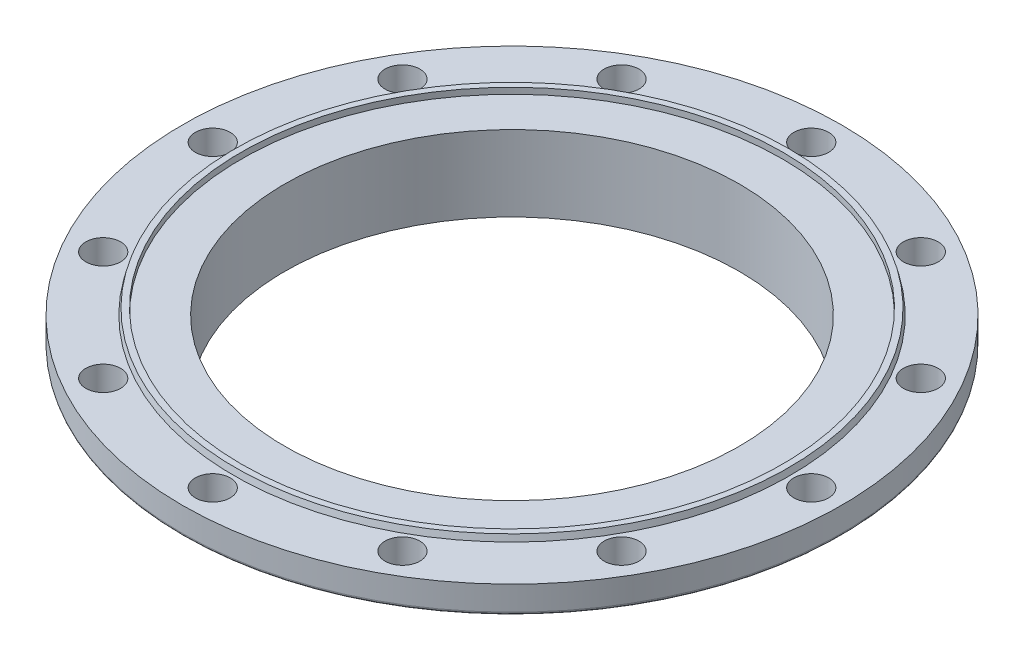
ISO-10303-21;
HEADER;
FILE_DESCRIPTION(('STEP AP214'),'2;1');
FILE_NAME('part.step','',(''),(''),'','','');
FILE_SCHEMA(('AUTOMOTIVE_DESIGN { 1 0 10303 214 1 1 1 1 }'));
ENDSEC;
DATA;
#1=APPLICATION_CONTEXT('core data for automotive mechanical design processes');
#2=APPLICATION_PROTOCOL_DEFINITION('international standard','automotive_design',2000,#1);
#3=PRODUCT_CONTEXT('',#1,'mechanical');
#4=PRODUCT('Part','Part','',(#3));
#5=PRODUCT_RELATED_PRODUCT_CATEGORY('part','',(#4));
#6=PRODUCT_DEFINITION_FORMATION('','',#4);
#7=PRODUCT_DEFINITION_CONTEXT('part definition',#1,'design');
#8=PRODUCT_DEFINITION('design','',#6,#7);
#9=PRODUCT_DEFINITION_SHAPE('','',#8);
#10=(LENGTH_UNIT() NAMED_UNIT(*) SI_UNIT(.MILLI.,.METRE.));
#11=(NAMED_UNIT(*) PLANE_ANGLE_UNIT() SI_UNIT($,.RADIAN.));
#12=(NAMED_UNIT(*) SI_UNIT($,.STERADIAN.) SOLID_ANGLE_UNIT());
#13=UNCERTAINTY_MEASURE_WITH_UNIT(LENGTH_MEASURE(1.E-05),#10,'distance_accuracy_value','');
#14=(GEOMETRIC_REPRESENTATION_CONTEXT(3) GLOBAL_UNCERTAINTY_ASSIGNED_CONTEXT((#13)) GLOBAL_UNIT_ASSIGNED_CONTEXT((#10,
#11,#12)) REPRESENTATION_CONTEXT('',''));
#15=CARTESIAN_POINT('',(0.,0.,0.));
#16=DIRECTION('',(0.,0.,1.));
#17=DIRECTION('',(1.,0.,0.));
#18=AXIS2_PLACEMENT_3D('',#15,#16,#17);
#19=CARTESIAN_POINT('',(-165.,0.,0.));
#20=DIRECTION('',(0.,1.,0.));
#21=DIRECTION('',(0.,0.,1.));
#22=AXIS2_PLACEMENT_3D('',#19,#20,#21);
#23=PLANE('',#22);
#24=CARTESIAN_POINT('',(0.,0.,0.));
#25=DIRECTION('',(0.,-1.,0.));
#26=DIRECTION('',(0.,0.,-1.));
#27=AXIS2_PLACEMENT_3D('',#24,#25,#26);
#28=CIRCLE('',#27,150.);
#29=CARTESIAN_POINT('',(0.,0.,-150.));
#30=VERTEX_POINT('',#29);
#31=EDGE_CURVE('E10',#30,#30,#28,.T.);
#32=ORIENTED_EDGE('',*,*,#31,.F.);
#33=EDGE_LOOP('',(#32));
#34=FACE_BOUND('',#33,.T.);
#35=CARTESIAN_POINT('',(0.,0.,0.));
#36=DIRECTION('',(0.,-1.,0.));
#37=DIRECTION('',(0.,0.,-1.));
#38=AXIS2_PLACEMENT_3D('',#35,#36,#37);
#39=CIRCLE('',#38,165.);
#40=CARTESIAN_POINT('',(0.,0.,-165.));
#41=VERTEX_POINT('',#40);
#42=EDGE_CURVE('E51',#41,#41,#39,.T.);
#43=ORIENTED_EDGE('',*,*,#42,.T.);
#44=EDGE_LOOP('',(#43));
#45=FACE_BOUND('',#44,.T.);
#46=ADVANCED_FACE('F32',(#34,#45),#23,.F.);
#47=CARTESIAN_POINT('',(0.,0.,0.));
#48=DIRECTION('',(0.,-1.,0.));
#49=DIRECTION('',(0.,0.,-1.));
#50=AXIS2_PLACEMENT_3D('',#47,#48,#49);
#51=CYLINDRICAL_SURFACE('',#50,150.);
#52=CARTESIAN_POINT('',(0.,50.,0.));
#53=DIRECTION('',(0.,-1.,0.));
#54=DIRECTION('',(0.,0.,-1.));
#55=AXIS2_PLACEMENT_3D('',#52,#53,#54);
#56=CIRCLE('',#55,150.);
#57=CARTESIAN_POINT('',(0.,50.,-150.));
#58=VERTEX_POINT('',#57);
#59=EDGE_CURVE('E39',#58,#58,#56,.T.);
#60=ORIENTED_EDGE('',*,*,#59,.F.);
#61=EDGE_LOOP('',(#60));
#62=FACE_BOUND('',#61,.T.);
#63=ORIENTED_EDGE('',*,*,#31,.T.);
#64=EDGE_LOOP('',(#63));
#65=FACE_BOUND('',#64,.T.);
#66=ADVANCED_FACE('F154',(#62,#65),#51,.F.);
#67=CARTESIAN_POINT('',(-150.,50.,0.));
#68=DIRECTION('',(0.,-1.,0.));
#69=DIRECTION('',(0.,0.,-1.));
#70=AXIS2_PLACEMENT_3D('',#67,#68,#69);
#71=PLANE('',#70);
#72=CARTESIAN_POINT('',(0.,50.,0.));
#73=DIRECTION('',(0.,-1.,0.));
#74=DIRECTION('',(0.,0.,-1.));
#75=AXIS2_PLACEMENT_3D('',#72,#73,#74);
#76=CIRCLE('',#75,178.5);
#77=CARTESIAN_POINT('',(0.,50.,-178.5));
#78=VERTEX_POINT('',#77);
#79=EDGE_CURVE('E44',#78,#78,#76,.T.);
#80=ORIENTED_EDGE('',*,*,#79,.F.);
#81=EDGE_LOOP('',(#80));
#82=FACE_BOUND('',#81,.T.);
#83=ORIENTED_EDGE('',*,*,#59,.T.);
#84=EDGE_LOOP('',(#83));
#85=FACE_BOUND('',#84,.T.);
#86=ADVANCED_FACE('F151',(#82,#85),#71,.F.);
#87=CARTESIAN_POINT('',(0.,0.,0.));
#88=DIRECTION('',(0.,-1.,0.));
#89=DIRECTION('',(0.,0.,-1.));
#90=AXIS2_PLACEMENT_3D('',#87,#88,#89);
#91=CYLINDRICAL_SURFACE('',#90,178.5);
#92=CARTESIAN_POINT('',(0.,54.,0.));
#93=DIRECTION('',(0.,-1.,0.));
#94=DIRECTION('',(0.,0.,-1.));
#95=AXIS2_PLACEMENT_3D('',#92,#93,#94);
#96=CIRCLE('',#95,178.5);
#97=CARTESIAN_POINT('',(0.,54.,-178.5));
#98=VERTEX_POINT('',#97);
#99=EDGE_CURVE('E144',#98,#98,#96,.T.);
#100=ORIENTED_EDGE('',*,*,#99,.F.);
#101=EDGE_LOOP('',(#100));
#102=FACE_BOUND('',#101,.T.);
#103=ORIENTED_EDGE('',*,*,#79,.T.);
#104=EDGE_LOOP('',(#103));
#105=FACE_BOUND('',#104,.T.);
#106=ADVANCED_FACE('F149',(#102,#105),#91,.F.);
#107=CARTESIAN_POINT('',(-178.5,54.,0.));
#108=DIRECTION('',(0.,-1.,0.));
#109=DIRECTION('',(0.,0.,-1.));
#110=AXIS2_PLACEMENT_3D('',#107,#108,#109);
#111=PLANE('',#110);
#112=CARTESIAN_POINT('',(0.,54.,0.));
#113=DIRECTION('',(0.,-1.,0.));
#114=DIRECTION('',(0.,0.,-1.));
#115=AXIS2_PLACEMENT_3D('',#112,#113,#114);
#116=CIRCLE('',#115,182.5);
#117=CARTESIAN_POINT('',(0.,54.,-182.5));
#118=VERTEX_POINT('',#117);
#119=EDGE_CURVE('E141',#118,#118,#116,.T.);
#120=ORIENTED_EDGE('',*,*,#119,.F.);
#121=EDGE_LOOP('',(#120));
#122=FACE_BOUND('',#121,.T.);
#123=ORIENTED_EDGE('',*,*,#99,.T.);
#124=EDGE_LOOP('',(#123));
#125=FACE_BOUND('',#124,.T.);
#126=ADVANCED_FACE('F166',(#122,#125),#111,.F.);
#127=CARTESIAN_POINT('',(0.,54.,0.));
#128=DIRECTION('',(0.,-1.,0.));
#129=DIRECTION('',(0.,0.,-1.));
#130=AXIS2_PLACEMENT_3D('',#127,#128,#129);
#131=CONICAL_SURFACE('',#130,182.5,0.244978663126865);
#132=CARTESIAN_POINT('',(0.,50.,0.));
#133=DIRECTION('',(0.,-1.,0.));
#134=DIRECTION('',(0.,0.,-1.));
#135=AXIS2_PLACEMENT_3D('',#132,#133,#134);
#136=CIRCLE('',#135,183.5);
#137=CARTESIAN_POINT('',(0.,50.,-183.5));
#138=VERTEX_POINT('',#137);
#139=EDGE_CURVE('E138',#138,#138,#136,.T.);
#140=ORIENTED_EDGE('',*,*,#139,.F.);
#141=EDGE_LOOP('',(#140));
#142=FACE_BOUND('',#141,.T.);
#143=ORIENTED_EDGE('',*,*,#119,.T.);
#144=EDGE_LOOP('',(#143));
#145=FACE_BOUND('',#144,.T.);
#146=ADVANCED_FACE('F170',(#142,#145),#131,.T.);
#147=CARTESIAN_POINT('',(-183.5,50.,0.));
#148=DIRECTION('',(0.,-1.,0.));
#149=DIRECTION('',(0.,0.,-1.));
#150=AXIS2_PLACEMENT_3D('',#147,#148,#149);
#151=PLANE('',#150);
#152=CARTESIAN_POINT('',(-171.040017247427,50.,98.7500000000001));
#153=DIRECTION('',(0.,1.,0.));
#154=DIRECTION('',(0.,0.,1.));
#155=AXIS2_PLACEMENT_3D('',#152,#153,#154);
#156=CIRCLE('',#155,11.5);
#157=CARTESIAN_POINT('',(-171.040017247427,50.,110.25));
#158=VERTEX_POINT('',#157);
#159=EDGE_CURVE('E100',#158,#158,#156,.T.);
#160=ORIENTED_EDGE('',*,*,#159,.F.);
#161=EDGE_LOOP('',(#160));
#162=FACE_BOUND('',#161,.T.);
#163=CARTESIAN_POINT('',(-98.7499999999999,50.,171.040017247427));
#164=DIRECTION('',(0.,1.,0.));
#165=DIRECTION('',(0.,0.,1.));
#166=AXIS2_PLACEMENT_3D('',#163,#164,#165);
#167=CIRCLE('',#166,11.5);
#168=CARTESIAN_POINT('',(-98.7499999999999,50.,182.540017247427));
#169=VERTEX_POINT('',#168);
#170=EDGE_CURVE('E90',#169,#169,#167,.T.);
#171=ORIENTED_EDGE('',*,*,#170,.F.);
#172=EDGE_LOOP('',(#171));
#173=FACE_BOUND('',#172,.T.);
#174=CARTESIAN_POINT('',(0.,50.,197.5));
#175=DIRECTION('',(0.,1.,0.));
#176=DIRECTION('',(0.,0.,1.));
#177=AXIS2_PLACEMENT_3D('',#174,#175,#176);
#178=CIRCLE('',#177,11.5);
#179=CARTESIAN_POINT('',(0.,50.,209.));
#180=VERTEX_POINT('',#179);
#181=EDGE_CURVE('E87',#180,#180,#178,.T.);
#182=ORIENTED_EDGE('',*,*,#181,.F.);
#183=EDGE_LOOP('',(#182));
#184=FACE_BOUND('',#183,.T.);
#185=CARTESIAN_POINT('',(98.7500000000001,50.,171.040017247427));
#186=DIRECTION('',(0.,1.,0.));
#187=DIRECTION('',(0.,0.,1.));
#188=AXIS2_PLACEMENT_3D('',#185,#186,#187);
#189=CIRCLE('',#188,11.5);
#190=CARTESIAN_POINT('',(98.7500000000001,50.,182.540017247427));
#191=VERTEX_POINT('',#190);
#192=EDGE_CURVE('E84',#191,#191,#189,.T.);
#193=ORIENTED_EDGE('',*,*,#192,.F.);
#194=EDGE_LOOP('',(#193));
#195=FACE_BOUND('',#194,.T.);
#196=CARTESIAN_POINT('',(171.040017247427,50.,98.7499999999999));
#197=DIRECTION('',(0.,1.,0.));
#198=DIRECTION('',(0.,0.,1.));
#199=AXIS2_PLACEMENT_3D('',#196,#197,#198);
#200=CIRCLE('',#199,11.5);
#201=CARTESIAN_POINT('',(171.040017247427,50.,110.25));
#202=VERTEX_POINT('',#201);
#203=EDGE_CURVE('E80',#202,#202,#200,.T.);
#204=ORIENTED_EDGE('',*,*,#203,.F.);
#205=EDGE_LOOP('',(#204));
#206=FACE_BOUND('',#205,.T.);
#207=CARTESIAN_POINT('',(197.5,50.,0.));
#208=DIRECTION('',(0.,1.,0.));
#209=DIRECTION('',(0.,0.,1.));
#210=AXIS2_PLACEMENT_3D('',#207,#208,#209);
#211=CIRCLE('',#210,11.5);
#212=CARTESIAN_POINT('',(197.5,50.,11.5));
#213=VERTEX_POINT('',#212);
#214=EDGE_CURVE('E76',#213,#213,#211,.T.);
#215=ORIENTED_EDGE('',*,*,#214,.F.);
#216=EDGE_LOOP('',(#215));
#217=FACE_BOUND('',#216,.T.);
#218=CARTESIAN_POINT('',(171.040017247427,50.,-98.7500000000001));
#219=DIRECTION('',(0.,1.,0.));
#220=DIRECTION('',(0.,0.,1.));
#221=AXIS2_PLACEMENT_3D('',#218,#219,#220);
#222=CIRCLE('',#221,11.5);
#223=CARTESIAN_POINT('',(171.040017247427,50.,-87.2500000000001));
#224=VERTEX_POINT('',#223);
#225=EDGE_CURVE('E72',#224,#224,#222,.T.);
#226=ORIENTED_EDGE('',*,*,#225,.F.);
#227=EDGE_LOOP('',(#226));
#228=FACE_BOUND('',#227,.T.);
#229=CARTESIAN_POINT('',(0.,50.,-197.5));
#230=DIRECTION('',(0.,1.,0.));
#231=DIRECTION('',(0.,0.,1.));
#232=AXIS2_PLACEMENT_3D('',#229,#230,#231);
#233=CIRCLE('',#232,11.5);
#234=CARTESIAN_POINT('',(0.,50.,-186.));
#235=VERTEX_POINT('',#234);
#236=EDGE_CURVE('E68',#235,#235,#233,.T.);
#237=ORIENTED_EDGE('',*,*,#236,.F.);
#238=EDGE_LOOP('',(#237));
#239=FACE_BOUND('',#238,.T.);
#240=CARTESIAN_POINT('',(-98.75,50.,-171.040017247427));
#241=DIRECTION('',(0.,1.,0.));
#242=DIRECTION('',(0.,0.,1.));
#243=AXIS2_PLACEMENT_3D('',#240,#241,#242);
#244=CIRCLE('',#243,11.5);
#245=CARTESIAN_POINT('',(-98.75,50.,-159.540017247427));
#246=VERTEX_POINT('',#245);
#247=EDGE_CURVE('E64',#246,#246,#244,.T.);
#248=ORIENTED_EDGE('',*,*,#247,.F.);
#249=EDGE_LOOP('',(#248));
#250=FACE_BOUND('',#249,.T.);
#251=CARTESIAN_POINT('',(-171.040017247427,50.,-98.7500000000001));
#252=DIRECTION('',(0.,1.,0.));
#253=DIRECTION('',(0.,0.,1.));
#254=AXIS2_PLACEMENT_3D('',#251,#252,#253);
#255=CIRCLE('',#254,11.5);
#256=CARTESIAN_POINT('',(-171.040017247427,50.,-87.2500000000001));
#257=VERTEX_POINT('',#256);
#258=EDGE_CURVE('E60',#257,#257,#255,.T.);
#259=ORIENTED_EDGE('',*,*,#258,.F.);
#260=EDGE_LOOP('',(#259));
#261=FACE_BOUND('',#260,.T.);
#262=CARTESIAN_POINT('',(98.75,50.,-171.040017247427));
#263=DIRECTION('',(0.,1.,0.));
#264=DIRECTION('',(0.,0.,1.));
#265=AXIS2_PLACEMENT_3D('',#262,#263,#264);
#266=CIRCLE('',#265,11.5);
#267=CARTESIAN_POINT('',(98.75,50.,-159.540017247427));
#268=VERTEX_POINT('',#267);
#269=EDGE_CURVE('E56',#268,#268,#266,.T.);
#270=ORIENTED_EDGE('',*,*,#269,.F.);
#271=EDGE_LOOP('',(#270));
#272=FACE_BOUND('',#271,.T.);
#273=CARTESIAN_POINT('',(-197.5,50.,0.));
#274=DIRECTION('',(0.,1.,0.));
#275=DIRECTION('',(0.,0.,1.));
#276=AXIS2_PLACEMENT_3D('',#273,#274,#275);
#277=CIRCLE('',#276,11.5);
#278=CARTESIAN_POINT('',(-197.5,50.,11.5));
#279=VERTEX_POINT('',#278);
#280=EDGE_CURVE('E52',#279,#279,#277,.T.);
#281=ORIENTED_EDGE('',*,*,#280,.F.);
#282=EDGE_LOOP('',(#281));
#283=FACE_BOUND('',#282,.T.);
#284=CARTESIAN_POINT('',(0.,50.,0.));
#285=DIRECTION('',(0.,-1.,0.));
#286=DIRECTION('',(0.,0.,-1.));
#287=AXIS2_PLACEMENT_3D('',#284,#285,#286);
#288=CIRCLE('',#287,217.5);
#289=CARTESIAN_POINT('',(0.,50.,-217.5));
#290=VERTEX_POINT('',#289);
#291=EDGE_CURVE('E135',#290,#290,#288,.T.);
#292=ORIENTED_EDGE('',*,*,#291,.F.);
#293=EDGE_LOOP('',(#292));
#294=FACE_BOUND('',#293,.T.);
#295=ORIENTED_EDGE('',*,*,#139,.T.);
#296=EDGE_LOOP('',(#295));
#297=FACE_BOUND('',#296,.T.);
#298=ADVANCED_FACE('F174',(#162,#173,#184,#195,#206,#217,#228,#239,#250,#261,#272,#283,#294,
#297),#151,.F.);
#299=CARTESIAN_POINT('',(0.,0.,0.));
#300=DIRECTION('',(0.,-1.,0.));
#301=DIRECTION('',(0.,0.,-1.));
#302=AXIS2_PLACEMENT_3D('',#299,#300,#301);
#303=CYLINDRICAL_SURFACE('',#302,217.5);
#304=CARTESIAN_POINT('',(0.,34.,0.));
#305=DIRECTION('',(0.,-1.,0.));
#306=DIRECTION('',(0.,0.,-1.));
#307=AXIS2_PLACEMENT_3D('',#304,#305,#306);
#308=CIRCLE('',#307,217.5);
#309=CARTESIAN_POINT('',(0.,34.,-217.5));
#310=VERTEX_POINT('',#309);
#311=EDGE_CURVE('E132',#310,#310,#308,.T.);
#312=ORIENTED_EDGE('',*,*,#311,.F.);
#313=EDGE_LOOP('',(#312));
#314=FACE_BOUND('',#313,.T.);
#315=ORIENTED_EDGE('',*,*,#291,.T.);
#316=EDGE_LOOP('',(#315));
#317=FACE_BOUND('',#316,.T.);
#318=ADVANCED_FACE('F178',(#314,#317),#303,.T.);
#319=CARTESIAN_POINT('',(0.,34.,0.));
#320=DIRECTION('',(0.,-1.,0.));
#321=DIRECTION('',(0.,0.,-1.));
#322=AXIS2_PLACEMENT_3D('',#319,#320,#321);
#323=TOROIDAL_SURFACE('',#322,215.5,2.00000000000001);
#324=CARTESIAN_POINT('',(0.,32.,0.));
#325=DIRECTION('',(0.,-1.,0.));
#326=DIRECTION('',(0.,0.,-1.));
#327=AXIS2_PLACEMENT_3D('',#324,#325,#326);
#328=CIRCLE('',#327,215.5);
#329=CARTESIAN_POINT('',(0.,32.,-215.5));
#330=VERTEX_POINT('',#329);
#331=EDGE_CURVE('E129',#330,#330,#328,.T.);
#332=ORIENTED_EDGE('',*,*,#331,.F.);
#333=EDGE_LOOP('',(#332));
#334=FACE_BOUND('',#333,.T.);
#335=ORIENTED_EDGE('',*,*,#311,.T.);
#336=EDGE_LOOP('',(#335));
#337=FACE_BOUND('',#336,.T.);
#338=ADVANCED_FACE('F182',(#334,#337),#323,.T.);
#339=CARTESIAN_POINT('',(-215.5,32.,0.));
#340=DIRECTION('',(0.,1.,0.));
#341=DIRECTION('',(0.,0.,1.));
#342=AXIS2_PLACEMENT_3D('',#339,#340,#341);
#343=PLANE('',#342);
#344=CARTESIAN_POINT('',(-171.040017247427,32.,98.7500000000001));
#345=DIRECTION('',(0.,1.,0.));
#346=DIRECTION('',(0.,0.,1.));
#347=AXIS2_PLACEMENT_3D('',#344,#345,#346);
#348=CIRCLE('',#347,11.5);
#349=CARTESIAN_POINT('',(-171.040017247427,32.,110.25));
#350=VERTEX_POINT('',#349);
#351=EDGE_CURVE('E35',#350,#350,#348,.T.);
#352=ORIENTED_EDGE('',*,*,#351,.T.);
#353=EDGE_LOOP('',(#352));
#354=FACE_BOUND('',#353,.T.);
#355=CARTESIAN_POINT('',(-98.7499999999999,32.,171.040017247427));
#356=DIRECTION('',(0.,1.,0.));
#357=DIRECTION('',(0.,0.,1.));
#358=AXIS2_PLACEMENT_3D('',#355,#356,#357);
#359=CIRCLE('',#358,11.5);
#360=CARTESIAN_POINT('',(-98.7499999999999,32.,182.540017247427));
#361=VERTEX_POINT('',#360);
#362=EDGE_CURVE('E88',#361,#361,#359,.T.);
#363=ORIENTED_EDGE('',*,*,#362,.T.);
#364=EDGE_LOOP('',(#363));
#365=FACE_BOUND('',#364,.T.);
#366=CARTESIAN_POINT('',(0.,32.,197.5));
#367=DIRECTION('',(0.,1.,0.));
#368=DIRECTION('',(0.,0.,1.));
#369=AXIS2_PLACEMENT_3D('',#366,#367,#368);
#370=CIRCLE('',#369,11.5);
#371=CARTESIAN_POINT('',(0.,32.,209.));
#372=VERTEX_POINT('',#371);
#373=EDGE_CURVE('E85',#372,#372,#370,.T.);
#374=ORIENTED_EDGE('',*,*,#373,.T.);
#375=EDGE_LOOP('',(#374));
#376=FACE_BOUND('',#375,.T.);
#377=CARTESIAN_POINT('',(98.7500000000001,32.,171.040017247427));
#378=DIRECTION('',(0.,1.,0.));
#379=DIRECTION('',(0.,0.,1.));
#380=AXIS2_PLACEMENT_3D('',#377,#378,#379);
#381=CIRCLE('',#380,11.5);
#382=CARTESIAN_POINT('',(98.7500000000001,32.,182.540017247427));
#383=VERTEX_POINT('',#382);
#384=EDGE_CURVE('E81',#383,#383,#381,.T.);
#385=ORIENTED_EDGE('',*,*,#384,.T.);
#386=EDGE_LOOP('',(#385));
#387=FACE_BOUND('',#386,.T.);
#388=CARTESIAN_POINT('',(171.040017247427,32.,98.7499999999999));
#389=DIRECTION('',(0.,1.,0.));
#390=DIRECTION('',(0.,0.,1.));
#391=AXIS2_PLACEMENT_3D('',#388,#389,#390);
#392=CIRCLE('',#391,11.5);
#393=CARTESIAN_POINT('',(171.040017247427,32.,110.25));
#394=VERTEX_POINT('',#393);
#395=EDGE_CURVE('E77',#394,#394,#392,.T.);
#396=ORIENTED_EDGE('',*,*,#395,.T.);
#397=EDGE_LOOP('',(#396));
#398=FACE_BOUND('',#397,.T.);
#399=CARTESIAN_POINT('',(197.5,32.,0.));
#400=DIRECTION('',(0.,1.,0.));
#401=DIRECTION('',(0.,0.,1.));
#402=AXIS2_PLACEMENT_3D('',#399,#400,#401);
#403=CIRCLE('',#402,11.5);
#404=CARTESIAN_POINT('',(197.5,32.,11.5));
#405=VERTEX_POINT('',#404);
#406=EDGE_CURVE('E73',#405,#405,#403,.T.);
#407=ORIENTED_EDGE('',*,*,#406,.T.);
#408=EDGE_LOOP('',(#407));
#409=FACE_BOUND('',#408,.T.);
#410=CARTESIAN_POINT('',(171.040017247427,32.,-98.7500000000001));
#411=DIRECTION('',(0.,1.,0.));
#412=DIRECTION('',(0.,0.,1.));
#413=AXIS2_PLACEMENT_3D('',#410,#411,#412);
#414=CIRCLE('',#413,11.5);
#415=CARTESIAN_POINT('',(171.040017247427,32.,-87.2500000000001));
#416=VERTEX_POINT('',#415);
#417=EDGE_CURVE('E69',#416,#416,#414,.T.);
#418=ORIENTED_EDGE('',*,*,#417,.T.);
#419=EDGE_LOOP('',(#418));
#420=FACE_BOUND('',#419,.T.);
#421=CARTESIAN_POINT('',(0.,32.,-197.5));
#422=DIRECTION('',(0.,1.,0.));
#423=DIRECTION('',(0.,0.,1.));
#424=AXIS2_PLACEMENT_3D('',#421,#422,#423);
#425=CIRCLE('',#424,11.5);
#426=CARTESIAN_POINT('',(0.,32.,-186.));
#427=VERTEX_POINT('',#426);
#428=EDGE_CURVE('E65',#427,#427,#425,.T.);
#429=ORIENTED_EDGE('',*,*,#428,.T.);
#430=EDGE_LOOP('',(#429));
#431=FACE_BOUND('',#430,.T.);
#432=CARTESIAN_POINT('',(-98.75,32.,-171.040017247427));
#433=DIRECTION('',(0.,1.,0.));
#434=DIRECTION('',(0.,0.,1.));
#435=AXIS2_PLACEMENT_3D('',#432,#433,#434);
#436=CIRCLE('',#435,11.5);
#437=CARTESIAN_POINT('',(-98.75,32.,-159.540017247427));
#438=VERTEX_POINT('',#437);
#439=EDGE_CURVE('E61',#438,#438,#436,.T.);
#440=ORIENTED_EDGE('',*,*,#439,.T.);
#441=EDGE_LOOP('',(#440));
#442=FACE_BOUND('',#441,.T.);
#443=CARTESIAN_POINT('',(-171.040017247427,32.,-98.7500000000001));
#444=DIRECTION('',(0.,1.,0.));
#445=DIRECTION('',(0.,0.,1.));
#446=AXIS2_PLACEMENT_3D('',#443,#444,#445);
#447=CIRCLE('',#446,11.5);
#448=CARTESIAN_POINT('',(-171.040017247427,32.,-87.2500000000001));
#449=VERTEX_POINT('',#448);
#450=EDGE_CURVE('E57',#449,#449,#447,.T.);
#451=ORIENTED_EDGE('',*,*,#450,.T.);
#452=EDGE_LOOP('',(#451));
#453=FACE_BOUND('',#452,.T.);
#454=CARTESIAN_POINT('',(98.75,32.,-171.040017247427));
#455=DIRECTION('',(0.,1.,0.));
#456=DIRECTION('',(0.,0.,1.));
#457=AXIS2_PLACEMENT_3D('',#454,#455,#456);
#458=CIRCLE('',#457,11.5);
#459=CARTESIAN_POINT('',(98.75,32.,-159.540017247427));
#460=VERTEX_POINT('',#459);
#461=EDGE_CURVE('E53',#460,#460,#458,.T.);
#462=ORIENTED_EDGE('',*,*,#461,.T.);
#463=EDGE_LOOP('',(#462));
#464=FACE_BOUND('',#463,.T.);
#465=CARTESIAN_POINT('',(-197.5,32.,0.));
#466=DIRECTION('',(0.,1.,0.));
#467=DIRECTION('',(0.,0.,1.));
#468=AXIS2_PLACEMENT_3D('',#465,#466,#467);
#469=CIRCLE('',#468,11.5);
#470=CARTESIAN_POINT('',(-197.5,32.,11.5));
#471=VERTEX_POINT('',#470);
#472=EDGE_CURVE('E48',#471,#471,#469,.T.);
#473=ORIENTED_EDGE('',*,*,#472,.T.);
#474=EDGE_LOOP('',(#473));
#475=FACE_BOUND('',#474,.T.);
#476=CARTESIAN_POINT('',(0.,32.,0.));
#477=DIRECTION('',(0.,-1.,0.));
#478=DIRECTION('',(0.,0.,-1.));
#479=AXIS2_PLACEMENT_3D('',#476,#477,#478);
#480=CIRCLE('',#479,175.991183949057);
#481=CARTESIAN_POINT('',(0.,32.,-175.991183949057));
#482=VERTEX_POINT('',#481);
#483=EDGE_CURVE('E126',#482,#482,#480,.T.);
#484=ORIENTED_EDGE('',*,*,#483,.F.);
#485=EDGE_LOOP('',(#484));
#486=FACE_BOUND('',#485,.T.);
#487=ORIENTED_EDGE('',*,*,#331,.T.);
#488=EDGE_LOOP('',(#487));
#489=FACE_BOUND('',#488,.T.);
#490=ADVANCED_FACE('F186',(#354,#365,#376,#387,#398,#409,#420,#431,#442,#453,#464,#475,#486,
#489),#343,.F.);
#491=CARTESIAN_POINT('',(0.,25.,0.));
#492=DIRECTION('',(0.,-1.,0.));
#493=DIRECTION('',(0.,0.,-1.));
#494=AXIS2_PLACEMENT_3D('',#491,#492,#493);
#495=TOROIDAL_SURFACE('',#494,175.991183949057,6.99999999999999);
#496=CARTESIAN_POINT('',(0.,26.0806381619153,0.));
#497=DIRECTION('',(0.,-1.,0.));
#498=DIRECTION('',(0.,0.,-1.));
#499=AXIS2_PLACEMENT_3D('',#496,#497,#498);
#500=CIRCLE('',#499,169.075099712799);
#501=CARTESIAN_POINT('',(0.,26.0806381619153,-169.075099712799));
#502=VERTEX_POINT('',#501);
#503=EDGE_CURVE('E123',#502,#502,#500,.T.);
#504=ORIENTED_EDGE('',*,*,#503,.F.);
#505=EDGE_LOOP('',(#504));
#506=FACE_BOUND('',#505,.T.);
#507=ORIENTED_EDGE('',*,*,#483,.T.);
#508=EDGE_LOOP('',(#507));
#509=FACE_BOUND('',#508,.T.);
#510=ADVANCED_FACE('F190',(#506,#509),#495,.F.);
#511=CARTESIAN_POINT('',(0.,26.0806381619153,0.));
#512=DIRECTION('',(0.,1.,0.));
#513=DIRECTION('',(0.,0.,1.));
#514=AXIS2_PLACEMENT_3D('',#511,#512,#513);
#515=CONICAL_SURFACE('',#514,169.075099712799,0.154996741923942);
#516=ORIENTED_EDGE('',*,*,#42,.F.);
#517=EDGE_LOOP('',(#516));
#518=FACE_BOUND('',#517,.T.);
#519=ORIENTED_EDGE('',*,*,#503,.T.);
#520=EDGE_LOOP('',(#519));
#521=FACE_BOUND('',#520,.T.);
#522=ADVANCED_FACE('F194',(#518,#521),#515,.T.);
#523=CARTESIAN_POINT('',(-197.5,0.,0.));
#524=DIRECTION('',(0.,1.,0.));
#525=DIRECTION('',(0.,0.,1.));
#526=AXIS2_PLACEMENT_3D('',#523,#524,#525);
#527=CYLINDRICAL_SURFACE('',#526,11.5);
#528=ORIENTED_EDGE('',*,*,#280,.T.);
#529=EDGE_LOOP('',(#528));
#530=FACE_BOUND('',#529,.T.);
#531=ORIENTED_EDGE('',*,*,#472,.F.);
#532=EDGE_LOOP('',(#531));
#533=FACE_BOUND('',#532,.T.);
#534=ADVANCED_FACE('F198',(#530,#533),#527,.F.);
#535=CARTESIAN_POINT('',(98.75,0.,-171.040017247427));
#536=DIRECTION('',(0.,1.,0.));
#537=DIRECTION('',(0.,0.,1.));
#538=AXIS2_PLACEMENT_3D('',#535,#536,#537);
#539=CYLINDRICAL_SURFACE('',#538,11.5);
#540=ORIENTED_EDGE('',*,*,#269,.T.);
#541=EDGE_LOOP('',(#540));
#542=FACE_BOUND('',#541,.T.);
#543=ORIENTED_EDGE('',*,*,#461,.F.);
#544=EDGE_LOOP('',(#543));
#545=FACE_BOUND('',#544,.T.);
#546=ADVANCED_FACE('F202',(#542,#545),#539,.F.);
#547=CARTESIAN_POINT('',(-171.040017247427,0.,-98.7500000000001));
#548=DIRECTION('',(0.,1.,0.));
#549=DIRECTION('',(0.,0.,1.));
#550=AXIS2_PLACEMENT_3D('',#547,#548,#549);
#551=CYLINDRICAL_SURFACE('',#550,11.5);
#552=ORIENTED_EDGE('',*,*,#258,.T.);
#553=EDGE_LOOP('',(#552));
#554=FACE_BOUND('',#553,.T.);
#555=ORIENTED_EDGE('',*,*,#450,.F.);
#556=EDGE_LOOP('',(#555));
#557=FACE_BOUND('',#556,.T.);
#558=ADVANCED_FACE('F206',(#554,#557),#551,.F.);
#559=CARTESIAN_POINT('',(-98.75,0.,-171.040017247427));
#560=DIRECTION('',(0.,1.,0.));
#561=DIRECTION('',(0.,0.,1.));
#562=AXIS2_PLACEMENT_3D('',#559,#560,#561);
#563=CYLINDRICAL_SURFACE('',#562,11.5);
#564=ORIENTED_EDGE('',*,*,#247,.T.);
#565=EDGE_LOOP('',(#564));
#566=FACE_BOUND('',#565,.T.);
#567=ORIENTED_EDGE('',*,*,#439,.F.);
#568=EDGE_LOOP('',(#567));
#569=FACE_BOUND('',#568,.T.);
#570=ADVANCED_FACE('F210',(#566,#569),#563,.F.);
#571=CARTESIAN_POINT('',(0.,0.,-197.5));
#572=DIRECTION('',(0.,1.,0.));
#573=DIRECTION('',(0.,0.,1.));
#574=AXIS2_PLACEMENT_3D('',#571,#572,#573);
#575=CYLINDRICAL_SURFACE('',#574,11.5);
#576=ORIENTED_EDGE('',*,*,#236,.T.);
#577=EDGE_LOOP('',(#576));
#578=FACE_BOUND('',#577,.T.);
#579=ORIENTED_EDGE('',*,*,#428,.F.);
#580=EDGE_LOOP('',(#579));
#581=FACE_BOUND('',#580,.T.);
#582=ADVANCED_FACE('F214',(#578,#581),#575,.F.);
#583=CARTESIAN_POINT('',(171.040017247427,0.,-98.7500000000001));
#584=DIRECTION('',(0.,1.,0.));
#585=DIRECTION('',(0.,0.,1.));
#586=AXIS2_PLACEMENT_3D('',#583,#584,#585);
#587=CYLINDRICAL_SURFACE('',#586,11.5);
#588=ORIENTED_EDGE('',*,*,#225,.T.);
#589=EDGE_LOOP('',(#588));
#590=FACE_BOUND('',#589,.T.);
#591=ORIENTED_EDGE('',*,*,#417,.F.);
#592=EDGE_LOOP('',(#591));
#593=FACE_BOUND('',#592,.T.);
#594=ADVANCED_FACE('F218',(#590,#593),#587,.F.);
#595=CARTESIAN_POINT('',(197.5,0.,0.));
#596=DIRECTION('',(0.,1.,0.));
#597=DIRECTION('',(0.,0.,1.));
#598=AXIS2_PLACEMENT_3D('',#595,#596,#597);
#599=CYLINDRICAL_SURFACE('',#598,11.5);
#600=ORIENTED_EDGE('',*,*,#214,.T.);
#601=EDGE_LOOP('',(#600));
#602=FACE_BOUND('',#601,.T.);
#603=ORIENTED_EDGE('',*,*,#406,.F.);
#604=EDGE_LOOP('',(#603));
#605=FACE_BOUND('',#604,.T.);
#606=ADVANCED_FACE('F222',(#602,#605),#599,.F.);
#607=CARTESIAN_POINT('',(171.040017247427,0.,98.7499999999999));
#608=DIRECTION('',(0.,1.,0.));
#609=DIRECTION('',(0.,0.,1.));
#610=AXIS2_PLACEMENT_3D('',#607,#608,#609);
#611=CYLINDRICAL_SURFACE('',#610,11.5);
#612=ORIENTED_EDGE('',*,*,#203,.T.);
#613=EDGE_LOOP('',(#612));
#614=FACE_BOUND('',#613,.T.);
#615=ORIENTED_EDGE('',*,*,#395,.F.);
#616=EDGE_LOOP('',(#615));
#617=FACE_BOUND('',#616,.T.);
#618=ADVANCED_FACE('F226',(#614,#617),#611,.F.);
#619=CARTESIAN_POINT('',(98.7500000000001,0.,171.040017247427));
#620=DIRECTION('',(0.,1.,0.));
#621=DIRECTION('',(0.,0.,1.));
#622=AXIS2_PLACEMENT_3D('',#619,#620,#621);
#623=CYLINDRICAL_SURFACE('',#622,11.5);
#624=ORIENTED_EDGE('',*,*,#192,.T.);
#625=EDGE_LOOP('',(#624));
#626=FACE_BOUND('',#625,.T.);
#627=ORIENTED_EDGE('',*,*,#384,.F.);
#628=EDGE_LOOP('',(#627));
#629=FACE_BOUND('',#628,.T.);
#630=ADVANCED_FACE('F230',(#626,#629),#623,.F.);
#631=CARTESIAN_POINT('',(0.,0.,197.5));
#632=DIRECTION('',(0.,1.,0.));
#633=DIRECTION('',(0.,0.,1.));
#634=AXIS2_PLACEMENT_3D('',#631,#632,#633);
#635=CYLINDRICAL_SURFACE('',#634,11.5);
#636=ORIENTED_EDGE('',*,*,#181,.T.);
#637=EDGE_LOOP('',(#636));
#638=FACE_BOUND('',#637,.T.);
#639=ORIENTED_EDGE('',*,*,#373,.F.);
#640=EDGE_LOOP('',(#639));
#641=FACE_BOUND('',#640,.T.);
#642=ADVANCED_FACE('F234',(#638,#641),#635,.F.);
#643=CARTESIAN_POINT('',(-98.7499999999999,0.,171.040017247427));
#644=DIRECTION('',(0.,1.,0.));
#645=DIRECTION('',(0.,0.,1.));
#646=AXIS2_PLACEMENT_3D('',#643,#644,#645);
#647=CYLINDRICAL_SURFACE('',#646,11.5);
#648=ORIENTED_EDGE('',*,*,#170,.T.);
#649=EDGE_LOOP('',(#648));
#650=FACE_BOUND('',#649,.T.);
#651=ORIENTED_EDGE('',*,*,#362,.F.);
#652=EDGE_LOOP('',(#651));
#653=FACE_BOUND('',#652,.T.);
#654=ADVANCED_FACE('F238',(#650,#653),#647,.F.);
#655=CARTESIAN_POINT('',(-171.040017247427,0.,98.7500000000001));
#656=DIRECTION('',(0.,1.,0.));
#657=DIRECTION('',(0.,0.,1.));
#658=AXIS2_PLACEMENT_3D('',#655,#656,#657);
#659=CYLINDRICAL_SURFACE('',#658,11.5);
#660=ORIENTED_EDGE('',*,*,#159,.T.);
#661=EDGE_LOOP('',(#660));
#662=FACE_BOUND('',#661,.T.);
#663=ORIENTED_EDGE('',*,*,#351,.F.);
#664=EDGE_LOOP('',(#663));
#665=FACE_BOUND('',#664,.T.);
#666=ADVANCED_FACE('F242',(#662,#665),#659,.F.);
#667=CLOSED_SHELL('',(#46,#66,#86,#106,#126,#146,#298,#318,#338,#490,#510,#522,#534,#546,#558,
#570,#582,#594,#606,#618,#630,#642,#654,#666));
#668=MANIFOLD_SOLID_BREP('B2',#667);
#669=ADVANCED_BREP_SHAPE_REPRESENTATION('',(#18,#668),#14);
#670=SHAPE_DEFINITION_REPRESENTATION(#9,#669);
ENDSEC;
END-ISO-10303-21;
